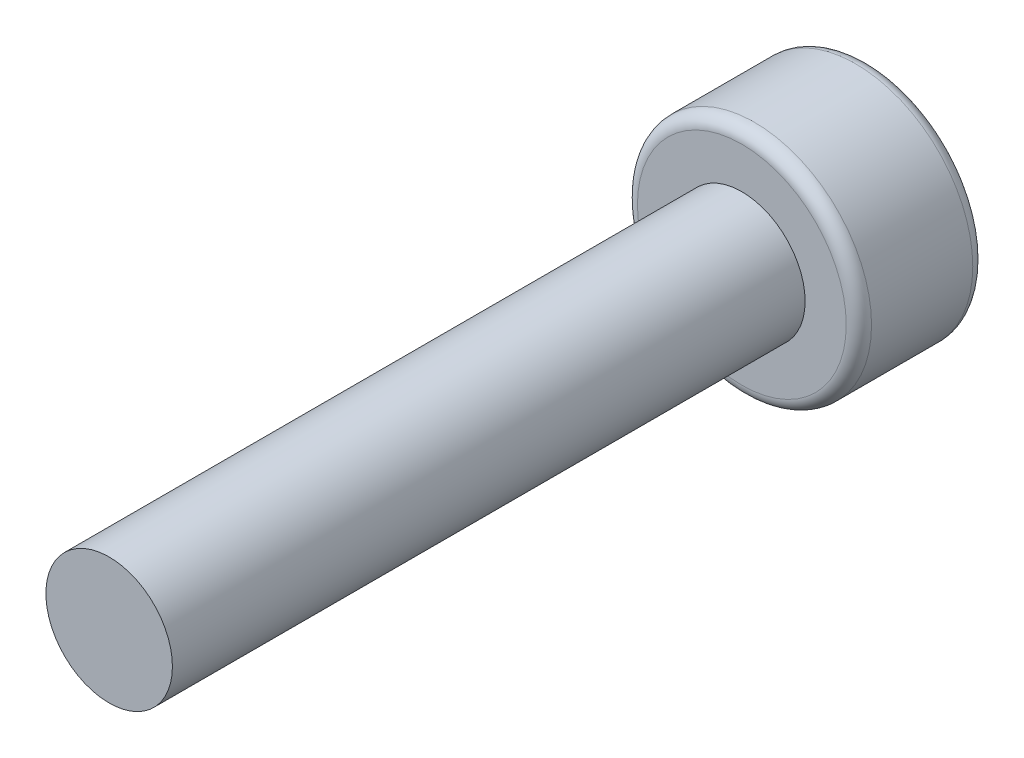
ISO-10303-21;
HEADER;
FILE_DESCRIPTION(('STEP AP214'),'2;1');
FILE_NAME('part.step','',(''),(''),'','','');
FILE_SCHEMA(('AUTOMOTIVE_DESIGN { 1 0 10303 214 1 1 1 1 }'));
ENDSEC;
DATA;
#1=APPLICATION_CONTEXT('core data for automotive mechanical design processes');
#2=APPLICATION_PROTOCOL_DEFINITION('international standard','automotive_design',2000,#1);
#3=PRODUCT_CONTEXT('',#1,'mechanical');
#4=PRODUCT('Part','Part','',(#3));
#5=PRODUCT_RELATED_PRODUCT_CATEGORY('part','',(#4));
#6=PRODUCT_DEFINITION_FORMATION('','',#4);
#7=PRODUCT_DEFINITION_CONTEXT('part definition',#1,'design');
#8=PRODUCT_DEFINITION('design','',#6,#7);
#9=PRODUCT_DEFINITION_SHAPE('','',#8);
#10=(LENGTH_UNIT() NAMED_UNIT(*) SI_UNIT(.MILLI.,.METRE.));
#11=(NAMED_UNIT(*) PLANE_ANGLE_UNIT() SI_UNIT($,.RADIAN.));
#12=(NAMED_UNIT(*) SI_UNIT($,.STERADIAN.) SOLID_ANGLE_UNIT());
#13=UNCERTAINTY_MEASURE_WITH_UNIT(LENGTH_MEASURE(1.E-05),#10,'distance_accuracy_value','');
#14=(GEOMETRIC_REPRESENTATION_CONTEXT(3) GLOBAL_UNCERTAINTY_ASSIGNED_CONTEXT((#13)) GLOBAL_UNIT_ASSIGNED_CONTEXT((#10,
#11,#12)) REPRESENTATION_CONTEXT('',''));
#15=CARTESIAN_POINT('',(0.,0.,0.));
#16=DIRECTION('',(0.,0.,1.));
#17=DIRECTION('',(1.,0.,0.));
#18=AXIS2_PLACEMENT_3D('',#15,#16,#17);
#19=CARTESIAN_POINT('',(0.,0.,2.));
#20=DIRECTION('',(0.,0.,-1.));
#21=DIRECTION('',(-1.,0.,0.));
#22=AXIS2_PLACEMENT_3D('',#19,#20,#21);
#23=CYLINDRICAL_SURFACE('',#22,1.85);
#24=CARTESIAN_POINT('',(0.,0.,0.2));
#25=DIRECTION('',(0.,0.,1.));
#26=DIRECTION('',(1.,0.,0.));
#27=AXIS2_PLACEMENT_3D('',#24,#25,#26);
#28=CIRCLE('',#27,1.85);
#29=CARTESIAN_POINT('',(1.85,0.,0.2));
#30=VERTEX_POINT('',#29);
#31=EDGE_CURVE('E155',#30,#30,#28,.T.);
#32=ORIENTED_EDGE('',*,*,#31,.T.);
#33=EDGE_LOOP('',(#32));
#34=FACE_BOUND('',#33,.T.);
#35=CARTESIAN_POINT('',(0.,0.,1.8));
#36=DIRECTION('',(0.,0.,1.));
#37=DIRECTION('',(1.,0.,0.));
#38=AXIS2_PLACEMENT_3D('',#35,#36,#37);
#39=CIRCLE('',#38,1.85);
#40=CARTESIAN_POINT('',(1.85,0.,1.8));
#41=VERTEX_POINT('',#40);
#42=EDGE_CURVE('E152',#41,#41,#39,.F.);
#43=ORIENTED_EDGE('',*,*,#42,.T.);
#44=EDGE_LOOP('',(#43));
#45=FACE_BOUND('',#44,.T.);
#46=ADVANCED_FACE('F39',(#34,#45),#23,.T.);
#47=CARTESIAN_POINT('',(0.,0.,2.));
#48=DIRECTION('',(0.,0.,1.));
#49=DIRECTION('',(1.,0.,0.));
#50=AXIS2_PLACEMENT_3D('',#47,#48,#49);
#51=PLANE('',#50);
#52=CARTESIAN_POINT('',(0.,0.,2.));
#53=DIRECTION('',(0.,0.,1.));
#54=DIRECTION('',(1.,0.,0.));
#55=AXIS2_PLACEMENT_3D('',#52,#53,#54);
#56=CIRCLE('',#55,1.65);
#57=CARTESIAN_POINT('',(1.65,0.,2.));
#58=VERTEX_POINT('',#57);
#59=EDGE_CURVE('E11',#58,#58,#56,.T.);
#60=ORIENTED_EDGE('',*,*,#59,.T.);
#61=EDGE_LOOP('',(#60));
#62=FACE_BOUND('',#61,.T.);
#63=CARTESIAN_POINT('',(0.,0.,2.));
#64=DIRECTION('',(0.,0.,1.));
#65=DIRECTION('',(1.,0.,0.));
#66=AXIS2_PLACEMENT_3D('',#63,#64,#65);
#67=CIRCLE('',#66,1.);
#68=CARTESIAN_POINT('',(1.,0.,2.));
#69=VERTEX_POINT('',#68);
#70=EDGE_CURVE('E149',#69,#69,#67,.T.);
#71=ORIENTED_EDGE('',*,*,#70,.F.);
#72=EDGE_LOOP('',(#71));
#73=FACE_BOUND('',#72,.T.);
#74=ADVANCED_FACE('F170',(#62,#73),#51,.T.);
#75=CARTESIAN_POINT('',(0.,0.,0.));
#76=DIRECTION('',(0.,0.,1.));
#77=DIRECTION('',(1.,0.,0.));
#78=AXIS2_PLACEMENT_3D('',#75,#76,#77);
#79=PLANE('',#78);
#80=DIRECTION('',(0.698983626140259,-0.715137672331569,0.));
#81=VECTOR('',#80,1.);
#82=CARTESIAN_POINT('',(0.380295932212079,1.35708342933218,0.));
#83=LINE('',#82,#81);
#84=CARTESIAN_POINT('',(0.380295932212079,1.35708342933218,0.));
#85=VERTEX_POINT('',#84);
#86=CARTESIAN_POINT('',(1.36541669096261,0.349195776414543,0.));
#87=VERTEX_POINT('',#86);
#88=EDGE_CURVE('E128',#85,#87,#83,.T.);
#89=ORIENTED_EDGE('',*,*,#88,.F.);
#90=DIRECTION('',(0.96881920451254,0.247768740901045,0.));
#91=VECTOR('',#90,1.);
#92=CARTESIAN_POINT('',(-0.98512075875053,1.00788765291763,0.));
#93=LINE('',#92,#91);
#94=CARTESIAN_POINT('',(-0.98512075875053,1.00788765291763,0.));
#95=VERTEX_POINT('',#94);
#96=EDGE_CURVE('E54',#95,#85,#93,.T.);
#97=ORIENTED_EDGE('',*,*,#96,.F.);
#98=DIRECTION('',(0.26983557837228,0.962906413232614,0.));
#99=VECTOR('',#98,1.);
#100=CARTESIAN_POINT('',(-1.36541669096261,-0.349195776414544,0.));
#101=LINE('',#100,#99);
#102=CARTESIAN_POINT('',(-1.36541669096261,-0.349195776414544,0.));
#103=VERTEX_POINT('',#102);
#104=EDGE_CURVE('E137',#103,#95,#101,.T.);
#105=ORIENTED_EDGE('',*,*,#104,.F.);
#106=DIRECTION('',(-0.698983626140259,0.715137672331569,0.));
#107=VECTOR('',#106,1.);
#108=CARTESIAN_POINT('',(-0.380295932212079,-1.35708342933218,0.));
#109=LINE('',#108,#107);
#110=CARTESIAN_POINT('',(-0.380295932212079,-1.35708342933218,0.));
#111=VERTEX_POINT('',#110);
#112=EDGE_CURVE('E135',#111,#103,#109,.T.);
#113=ORIENTED_EDGE('',*,*,#112,.F.);
#114=DIRECTION('',(-0.96881920451254,-0.247768740901045,0.));
#115=VECTOR('',#114,1.);
#116=CARTESIAN_POINT('',(0.98512075875053,-1.00788765291763,0.));
#117=LINE('',#116,#115);
#118=CARTESIAN_POINT('',(0.98512075875053,-1.00788765291763,0.));
#119=VERTEX_POINT('',#118);
#120=EDGE_CURVE('E102',#119,#111,#117,.T.);
#121=ORIENTED_EDGE('',*,*,#120,.F.);
#122=DIRECTION('',(-0.269835578372281,-0.962906413232614,0.));
#123=VECTOR('',#122,1.);
#124=CARTESIAN_POINT('',(1.36541669096261,0.349195776414543,0.));
#125=LINE('',#124,#123);
#126=EDGE_CURVE('E131',#87,#119,#125,.T.);
#127=ORIENTED_EDGE('',*,*,#126,.F.);
#128=EDGE_LOOP('',(#89,#97,#105,#113,#121,#127));
#129=FACE_BOUND('',#128,.T.);
#130=CARTESIAN_POINT('',(0.,0.,0.));
#131=DIRECTION('',(0.,0.,1.));
#132=DIRECTION('',(1.,0.,0.));
#133=AXIS2_PLACEMENT_3D('',#130,#131,#132);
#134=CIRCLE('',#133,1.65);
#135=CARTESIAN_POINT('',(1.65,0.,0.));
#136=VERTEX_POINT('',#135);
#137=EDGE_CURVE('E47',#136,#136,#134,.F.);
#138=ORIENTED_EDGE('',*,*,#137,.T.);
#139=EDGE_LOOP('',(#138));
#140=FACE_BOUND('',#139,.T.);
#141=ADVANCED_FACE('F160',(#129,#140),#79,.F.);
#142=CARTESIAN_POINT('',(0.,0.,12.));
#143=DIRECTION('',(0.,0.,-1.));
#144=DIRECTION('',(-1.,0.,0.));
#145=AXIS2_PLACEMENT_3D('',#142,#143,#144);
#146=CYLINDRICAL_SURFACE('',#145,1.);
#147=CARTESIAN_POINT('',(0.,0.,12.));
#148=DIRECTION('',(0.,0.,1.));
#149=DIRECTION('',(1.,0.,0.));
#150=AXIS2_PLACEMENT_3D('',#147,#148,#149);
#151=CIRCLE('',#150,1.);
#152=CARTESIAN_POINT('',(1.,0.,12.));
#153=VERTEX_POINT('',#152);
#154=EDGE_CURVE('E141',#153,#153,#151,.T.);
#155=ORIENTED_EDGE('',*,*,#154,.F.);
#156=EDGE_LOOP('',(#155));
#157=FACE_BOUND('',#156,.T.);
#158=ORIENTED_EDGE('',*,*,#70,.T.);
#159=EDGE_LOOP('',(#158));
#160=FACE_BOUND('',#159,.T.);
#161=ADVANCED_FACE('F184',(#157,#160),#146,.T.);
#162=CARTESIAN_POINT('',(0.,0.,12.));
#163=DIRECTION('',(0.,0.,1.));
#164=DIRECTION('',(1.,0.,0.));
#165=AXIS2_PLACEMENT_3D('',#162,#163,#164);
#166=PLANE('',#165);
#167=ORIENTED_EDGE('',*,*,#154,.T.);
#168=EDGE_LOOP('',(#167));
#169=FACE_BOUND('',#168,.T.);
#170=ADVANCED_FACE('F165',(#169),#166,.T.);
#171=CARTESIAN_POINT('',(0.,0.,0.2));
#172=DIRECTION('',(0.,0.,1.));
#173=DIRECTION('',(1.,0.,0.));
#174=AXIS2_PLACEMENT_3D('',#171,#172,#173);
#175=TOROIDAL_SURFACE('',#174,1.65,0.2);
#176=ORIENTED_EDGE('',*,*,#137,.F.);
#177=EDGE_LOOP('',(#176));
#178=FACE_BOUND('',#177,.T.);
#179=ORIENTED_EDGE('',*,*,#31,.F.);
#180=EDGE_LOOP('',(#179));
#181=FACE_BOUND('',#180,.T.);
#182=ADVANCED_FACE('F162',(#178,#181),#175,.T.);
#183=CARTESIAN_POINT('',(0.,0.,1.8));
#184=DIRECTION('',(0.,0.,1.));
#185=DIRECTION('',(1.,0.,0.));
#186=AXIS2_PLACEMENT_3D('',#183,#184,#185);
#187=TOROIDAL_SURFACE('',#186,1.65,0.2);
#188=ORIENTED_EDGE('',*,*,#42,.F.);
#189=EDGE_LOOP('',(#188));
#190=FACE_BOUND('',#189,.T.);
#191=ORIENTED_EDGE('',*,*,#59,.F.);
#192=EDGE_LOOP('',(#191));
#193=FACE_BOUND('',#192,.T.);
#194=ADVANCED_FACE('F41',(#190,#193),#187,.T.);
#195=CARTESIAN_POINT('',(-0.98512075875053,1.00788765291763,1.));
#196=DIRECTION('',(-0.247768740901045,0.96881920451254,0.));
#197=DIRECTION('',(-0.96881920451254,-0.247768740901045,0.));
#198=AXIS2_PLACEMENT_3D('',#195,#196,#197);
#199=PLANE('',#198);
#200=ORIENTED_EDGE('',*,*,#96,.T.);
#201=DIRECTION('',(0.,0.,-1.));
#202=VECTOR('',#201,1.);
#203=CARTESIAN_POINT('',(0.380295932212079,1.35708342933218,1.));
#204=LINE('',#203,#202);
#205=CARTESIAN_POINT('',(0.380295932212079,1.35708342933218,1.));
#206=VERTEX_POINT('',#205);
#207=EDGE_CURVE('E84',#206,#85,#204,.T.);
#208=ORIENTED_EDGE('',*,*,#207,.F.);
#209=DIRECTION('',(0.96881920451254,0.247768740901045,0.));
#210=VECTOR('',#209,1.);
#211=CARTESIAN_POINT('',(-0.98512075875053,1.00788765291763,1.));
#212=LINE('',#211,#210);
#213=CARTESIAN_POINT('',(-0.98512075875053,1.00788765291763,1.));
#214=VERTEX_POINT('',#213);
#215=EDGE_CURVE('E139',#214,#206,#212,.T.);
#216=ORIENTED_EDGE('',*,*,#215,.F.);
#217=DIRECTION('',(0.,0.,-1.));
#218=VECTOR('',#217,1.);
#219=CARTESIAN_POINT('',(-0.98512075875053,1.00788765291763,1.));
#220=LINE('',#219,#218);
#221=EDGE_CURVE('E62',#214,#95,#220,.T.);
#222=ORIENTED_EDGE('',*,*,#221,.T.);
#223=EDGE_LOOP('',(#200,#208,#216,#222));
#224=FACE_BOUND('',#223,.T.);
#225=ADVANCED_FACE('F176',(#224),#199,.F.);
#226=CARTESIAN_POINT('',(-1.36541669096261,-0.349195776414544,1.));
#227=DIRECTION('',(-0.962906413232614,0.269835578372281,0.));
#228=DIRECTION('',(-0.269835578372281,-0.962906413232614,0.));
#229=AXIS2_PLACEMENT_3D('',#226,#227,#228);
#230=PLANE('',#229);
#231=ORIENTED_EDGE('',*,*,#104,.T.);
#232=ORIENTED_EDGE('',*,*,#221,.F.);
#233=DIRECTION('',(0.26983557837228,0.962906413232614,0.));
#234=VECTOR('',#233,1.);
#235=CARTESIAN_POINT('',(-1.36541669096261,-0.349195776414544,1.));
#236=LINE('',#235,#234);
#237=CARTESIAN_POINT('',(-1.36541669096261,-0.349195776414544,1.));
#238=VERTEX_POINT('',#237);
#239=EDGE_CURVE('E114',#238,#214,#236,.T.);
#240=ORIENTED_EDGE('',*,*,#239,.F.);
#241=DIRECTION('',(0.,0.,-1.));
#242=VECTOR('',#241,1.);
#243=CARTESIAN_POINT('',(-1.36541669096261,-0.349195776414544,1.));
#244=LINE('',#243,#242);
#245=EDGE_CURVE('E106',#238,#103,#244,.T.);
#246=ORIENTED_EDGE('',*,*,#245,.T.);
#247=EDGE_LOOP('',(#231,#232,#240,#246));
#248=FACE_BOUND('',#247,.T.);
#249=ADVANCED_FACE('F200',(#248),#230,.F.);
#250=CARTESIAN_POINT('',(-0.380295932212079,-1.35708342933218,1.));
#251=DIRECTION('',(-0.715137672331569,-0.698983626140259,0.));
#252=DIRECTION('',(0.698983626140259,-0.715137672331569,0.));
#253=AXIS2_PLACEMENT_3D('',#250,#251,#252);
#254=PLANE('',#253);
#255=ORIENTED_EDGE('',*,*,#112,.T.);
#256=ORIENTED_EDGE('',*,*,#245,.F.);
#257=DIRECTION('',(-0.698983626140259,0.715137672331569,0.));
#258=VECTOR('',#257,1.);
#259=CARTESIAN_POINT('',(-0.380295932212079,-1.35708342933218,1.));
#260=LINE('',#259,#258);
#261=CARTESIAN_POINT('',(-0.380295932212079,-1.35708342933218,1.));
#262=VERTEX_POINT('',#261);
#263=EDGE_CURVE('E110',#262,#238,#260,.T.);
#264=ORIENTED_EDGE('',*,*,#263,.F.);
#265=DIRECTION('',(0.,0.,-1.));
#266=VECTOR('',#265,1.);
#267=CARTESIAN_POINT('',(-0.380295932212079,-1.35708342933218,1.));
#268=LINE('',#267,#266);
#269=EDGE_CURVE('E95',#262,#111,#268,.T.);
#270=ORIENTED_EDGE('',*,*,#269,.T.);
#271=EDGE_LOOP('',(#255,#256,#264,#270));
#272=FACE_BOUND('',#271,.T.);
#273=ADVANCED_FACE('F111',(#272),#254,.F.);
#274=CARTESIAN_POINT('',(0.98512075875053,-1.00788765291763,1.));
#275=DIRECTION('',(0.247768740901045,-0.96881920451254,0.));
#276=DIRECTION('',(0.96881920451254,0.247768740901045,0.));
#277=AXIS2_PLACEMENT_3D('',#274,#275,#276);
#278=PLANE('',#277);
#279=ORIENTED_EDGE('',*,*,#120,.T.);
#280=ORIENTED_EDGE('',*,*,#269,.F.);
#281=DIRECTION('',(-0.96881920451254,-0.247768740901045,0.));
#282=VECTOR('',#281,1.);
#283=CARTESIAN_POINT('',(0.98512075875053,-1.00788765291763,1.));
#284=LINE('',#283,#282);
#285=CARTESIAN_POINT('',(0.98512075875053,-1.00788765291763,1.));
#286=VERTEX_POINT('',#285);
#287=EDGE_CURVE('E99',#286,#262,#284,.T.);
#288=ORIENTED_EDGE('',*,*,#287,.F.);
#289=DIRECTION('',(0.,0.,-1.));
#290=VECTOR('',#289,1.);
#291=CARTESIAN_POINT('',(0.98512075875053,-1.00788765291763,1.));
#292=LINE('',#291,#290);
#293=EDGE_CURVE('E107',#286,#119,#292,.T.);
#294=ORIENTED_EDGE('',*,*,#293,.T.);
#295=EDGE_LOOP('',(#279,#280,#288,#294));
#296=FACE_BOUND('',#295,.T.);
#297=ADVANCED_FACE('F97',(#296),#278,.F.);
#298=CARTESIAN_POINT('',(1.36541669096261,0.349195776414543,1.));
#299=DIRECTION('',(0.962906413232614,-0.269835578372281,0.));
#300=DIRECTION('',(0.269835578372281,0.962906413232614,0.));
#301=AXIS2_PLACEMENT_3D('',#298,#299,#300);
#302=PLANE('',#301);
#303=ORIENTED_EDGE('',*,*,#126,.T.);
#304=ORIENTED_EDGE('',*,*,#293,.F.);
#305=DIRECTION('',(-0.269835578372281,-0.962906413232614,0.));
#306=VECTOR('',#305,1.);
#307=CARTESIAN_POINT('',(1.36541669096261,0.349195776414543,1.));
#308=LINE('',#307,#306);
#309=CARTESIAN_POINT('',(1.36541669096261,0.349195776414543,1.));
#310=VERTEX_POINT('',#309);
#311=EDGE_CURVE('E120',#310,#286,#308,.T.);
#312=ORIENTED_EDGE('',*,*,#311,.F.);
#313=DIRECTION('',(0.,0.,-1.));
#314=VECTOR('',#313,1.);
#315=CARTESIAN_POINT('',(1.36541669096261,0.349195776414543,1.));
#316=LINE('',#315,#314);
#317=EDGE_CURVE('E144',#310,#87,#316,.T.);
#318=ORIENTED_EDGE('',*,*,#317,.T.);
#319=EDGE_LOOP('',(#303,#304,#312,#318));
#320=FACE_BOUND('',#319,.T.);
#321=ADVANCED_FACE('F204',(#320),#302,.F.);
#322=CARTESIAN_POINT('',(0.380295932212079,1.35708342933218,1.));
#323=DIRECTION('',(0.715137672331569,0.698983626140259,0.));
#324=DIRECTION('',(-0.698983626140259,0.715137672331569,0.));
#325=AXIS2_PLACEMENT_3D('',#322,#323,#324);
#326=PLANE('',#325);
#327=ORIENTED_EDGE('',*,*,#88,.T.);
#328=ORIENTED_EDGE('',*,*,#317,.F.);
#329=DIRECTION('',(0.698983626140259,-0.715137672331569,0.));
#330=VECTOR('',#329,1.);
#331=CARTESIAN_POINT('',(0.380295932212079,1.35708342933218,1.));
#332=LINE('',#331,#330);
#333=EDGE_CURVE('E122',#206,#310,#332,.T.);
#334=ORIENTED_EDGE('',*,*,#333,.F.);
#335=ORIENTED_EDGE('',*,*,#207,.T.);
#336=EDGE_LOOP('',(#327,#328,#334,#335));
#337=FACE_BOUND('',#336,.T.);
#338=ADVANCED_FACE('F201',(#337),#326,.F.);
#339=CARTESIAN_POINT('',(0.,0.,1.));
#340=DIRECTION('',(0.,0.,-1.));
#341=DIRECTION('',(-1.,0.,0.));
#342=AXIS2_PLACEMENT_3D('',#339,#340,#341);
#343=PLANE('',#342);
#344=ORIENTED_EDGE('',*,*,#215,.T.);
#345=ORIENTED_EDGE('',*,*,#333,.T.);
#346=ORIENTED_EDGE('',*,*,#311,.T.);
#347=ORIENTED_EDGE('',*,*,#287,.T.);
#348=ORIENTED_EDGE('',*,*,#263,.T.);
#349=ORIENTED_EDGE('',*,*,#239,.T.);
#350=EDGE_LOOP('',(#344,#345,#346,#347,#348,#349));
#351=FACE_BOUND('',#350,.T.);
#352=ADVANCED_FACE('F117',(#351),#343,.T.);
#353=CLOSED_SHELL('',(#46,#74,#141,#161,#170,#182,#194,#225,#249,#273,#297,#321,#338,#352));
#354=MANIFOLD_SOLID_BREP('B2',#353);
#355=ADVANCED_BREP_SHAPE_REPRESENTATION('',(#18,#354),#14);
#356=SHAPE_DEFINITION_REPRESENTATION(#9,#355);
ENDSEC;
END-ISO-10303-21;
